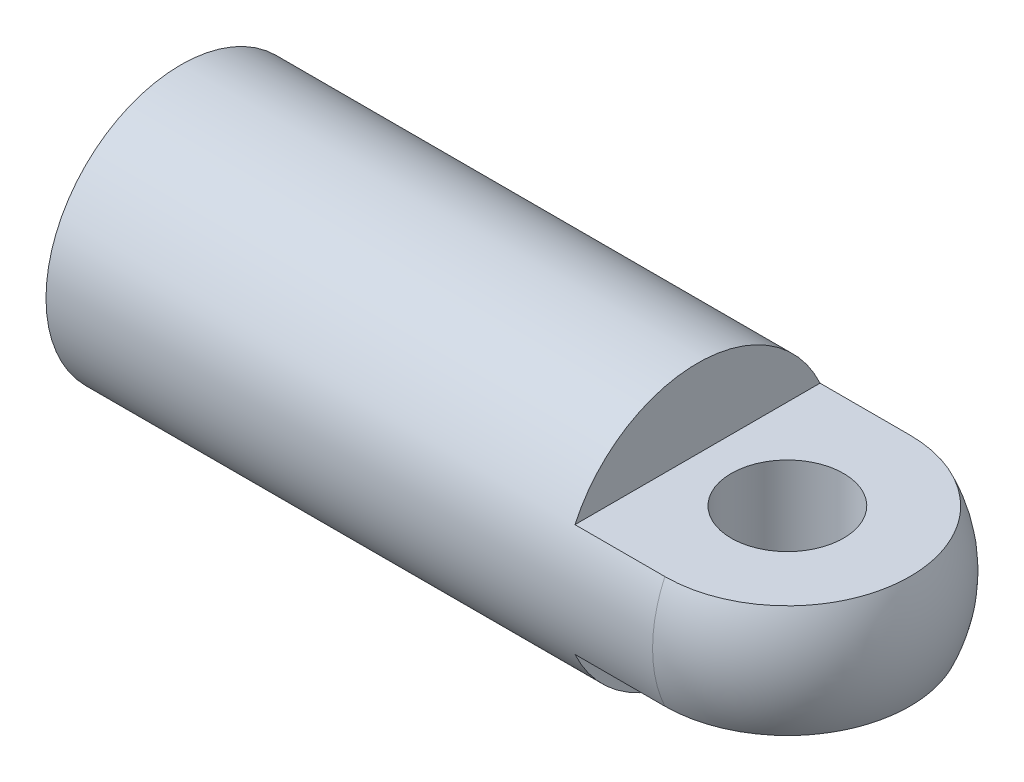
ISO-10303-21;
HEADER;
FILE_DESCRIPTION(('STEP AP214'),'2;1');
FILE_NAME('part.step','',(''),(''),'','','');
FILE_SCHEMA(('AUTOMOTIVE_DESIGN { 1 0 10303 214 1 1 1 1 }'));
ENDSEC;
DATA;
#1=APPLICATION_CONTEXT('core data for automotive mechanical design processes');
#2=APPLICATION_PROTOCOL_DEFINITION('international standard','automotive_design',2000,#1);
#3=PRODUCT_CONTEXT('',#1,'mechanical');
#4=PRODUCT('Part','Part','',(#3));
#5=PRODUCT_RELATED_PRODUCT_CATEGORY('part','',(#4));
#6=PRODUCT_DEFINITION_FORMATION('','',#4);
#7=PRODUCT_DEFINITION_CONTEXT('part definition',#1,'design');
#8=PRODUCT_DEFINITION('design','',#6,#7);
#9=PRODUCT_DEFINITION_SHAPE('','',#8);
#10=(LENGTH_UNIT() NAMED_UNIT(*) SI_UNIT(.MILLI.,.METRE.));
#11=(NAMED_UNIT(*) PLANE_ANGLE_UNIT() SI_UNIT($,.RADIAN.));
#12=(NAMED_UNIT(*) SI_UNIT($,.STERADIAN.) SOLID_ANGLE_UNIT());
#13=UNCERTAINTY_MEASURE_WITH_UNIT(LENGTH_MEASURE(1.E-05),#10,'distance_accuracy_value','');
#14=(GEOMETRIC_REPRESENTATION_CONTEXT(3) GLOBAL_UNCERTAINTY_ASSIGNED_CONTEXT((#13)) GLOBAL_UNIT_ASSIGNED_CONTEXT((#10,
#11,#12)) REPRESENTATION_CONTEXT('',''));
#15=CARTESIAN_POINT('',(0.,0.,0.));
#16=DIRECTION('',(0.,0.,1.));
#17=DIRECTION('',(1.,0.,0.));
#18=AXIS2_PLACEMENT_3D('',#15,#16,#17);
#19=CARTESIAN_POINT('',(-212.857142857143,0.,-80.));
#20=DIRECTION('',(-1.,0.,0.));
#21=DIRECTION('',(0.,0.,1.));
#22=AXIS2_PLACEMENT_3D('',#19,#20,#21);
#23=PLANE('',#22);
#24=CARTESIAN_POINT('',(-212.857142857143,0.,0.));
#25=DIRECTION('',(-1.,0.,0.));
#26=DIRECTION('',(0.,0.,1.));
#27=AXIS2_PLACEMENT_3D('',#24,#25,#26);
#28=CIRCLE('',#27,100.);
#29=CARTESIAN_POINT('',(-212.857142857143,0.,100.));
#30=VERTEX_POINT('',#29);
#31=EDGE_CURVE('E111',#30,#30,#28,.T.);
#32=ORIENTED_EDGE('',*,*,#31,.F.);
#33=EDGE_LOOP('',(#32));
#34=FACE_BOUND('',#33,.T.);
#35=CARTESIAN_POINT('',(-212.857142857143,0.,0.));
#36=DIRECTION('',(-1.,0.,0.));
#37=DIRECTION('',(0.,0.,1.));
#38=AXIS2_PLACEMENT_3D('',#35,#36,#37);
#39=CIRCLE('',#38,80.);
#40=CARTESIAN_POINT('',(-212.857142857143,0.,80.));
#41=VERTEX_POINT('',#40);
#42=EDGE_CURVE('E125',#41,#41,#39,.T.);
#43=ORIENTED_EDGE('',*,*,#42,.T.);
#44=EDGE_LOOP('',(#43));
#45=FACE_BOUND('',#44,.T.);
#46=ADVANCED_FACE('F45',(#34,#45),#23,.F.);
#47=CARTESIAN_POINT('',(-156.292678097973,0.,0.));
#48=DIRECTION('',(-1.,0.,0.));
#49=DIRECTION('',(0.,0.,1.));
#50=AXIS2_PLACEMENT_3D('',#47,#48,#49);
#51=CYLINDRICAL_SURFACE('',#50,80.);
#52=ORIENTED_EDGE('',*,*,#42,.F.);
#53=EDGE_LOOP('',(#52));
#54=FACE_BOUND('',#53,.T.);
#55=CARTESIAN_POINT('',(-232.857142857143,0.,0.));
#56=DIRECTION('',(-1.,0.,0.));
#57=DIRECTION('',(0.,0.,1.));
#58=AXIS2_PLACEMENT_3D('',#55,#56,#57);
#59=CIRCLE('',#58,80.);
#60=CARTESIAN_POINT('',(-232.857142857143,0.,80.));
#61=VERTEX_POINT('',#60);
#62=EDGE_CURVE('E122',#61,#61,#59,.T.);
#63=ORIENTED_EDGE('',*,*,#62,.T.);
#64=EDGE_LOOP('',(#63));
#65=FACE_BOUND('',#64,.T.);
#66=ADVANCED_FACE('F155',(#54,#65),#51,.F.);
#67=CARTESIAN_POINT('',(-232.857142857143,0.,-80.));
#68=DIRECTION('',(1.,0.,0.));
#69=DIRECTION('',(0.,0.,-1.));
#70=AXIS2_PLACEMENT_3D('',#67,#68,#69);
#71=PLANE('',#70);
#72=ORIENTED_EDGE('',*,*,#62,.F.);
#73=EDGE_LOOP('',(#72));
#74=FACE_BOUND('',#73,.T.);
#75=CARTESIAN_POINT('',(-232.857142857143,0.,0.));
#76=DIRECTION('',(-1.,0.,0.));
#77=DIRECTION('',(0.,0.,1.));
#78=AXIS2_PLACEMENT_3D('',#75,#76,#77);
#79=CIRCLE('',#78,120.);
#80=CARTESIAN_POINT('',(-232.857142857143,0.,120.));
#81=VERTEX_POINT('',#80);
#82=EDGE_CURVE('E119',#81,#81,#79,.T.);
#83=ORIENTED_EDGE('',*,*,#82,.T.);
#84=EDGE_LOOP('',(#83));
#85=FACE_BOUND('',#84,.T.);
#86=ADVANCED_FACE('F160',(#74,#85),#71,.F.);
#87=CARTESIAN_POINT('',(-156.292678097973,0.,0.));
#88=DIRECTION('',(-1.,0.,0.));
#89=DIRECTION('',(0.,0.,1.));
#90=AXIS2_PLACEMENT_3D('',#87,#88,#89);
#91=CYLINDRICAL_SURFACE('',#90,120.);
#92=ORIENTED_EDGE('',*,*,#82,.F.);
#93=EDGE_LOOP('',(#92));
#94=FACE_BOUND('',#93,.T.);
#95=CARTESIAN_POINT('',(307.142857142857,0.,0.));
#96=DIRECTION('',(-1.,0.,0.));
#97=DIRECTION('',(0.,0.,1.));
#98=AXIS2_PLACEMENT_3D('',#95,#96,#97);
#99=CIRCLE('',#98,120.);
#100=CARTESIAN_POINT('',(307.142857142857,-50.,109.087121146357));
#101=VERTEX_POINT('',#100);
#102=CARTESIAN_POINT('',(307.142857142857,50.,109.087121146357));
#103=VERTEX_POINT('',#102);
#104=EDGE_CURVE('E117',#101,#103,#99,.T.);
#105=ORIENTED_EDGE('',*,*,#104,.T.);
#106=DIRECTION('',(-1.,0.,0.));
#107=VECTOR('',#106,1.);
#108=CARTESIAN_POINT('',(-156.292678097973,49.9999999999999,109.087121146357));
#109=LINE('',#108,#107);
#110=CARTESIAN_POINT('',(227.142857142857,50.,109.087121146357));
#111=VERTEX_POINT('',#110);
#112=EDGE_CURVE('E68',#103,#111,#109,.T.);
#113=ORIENTED_EDGE('',*,*,#112,.T.);
#114=CARTESIAN_POINT('',(227.142857142857,0.,0.));
#115=DIRECTION('',(-1.,0.,0.));
#116=DIRECTION('',(0.,0.,1.));
#117=AXIS2_PLACEMENT_3D('',#114,#115,#116);
#118=CIRCLE('',#117,120.);
#119=CARTESIAN_POINT('',(227.142857142857,50.,-109.087121146357));
#120=VERTEX_POINT('',#119);
#121=EDGE_CURVE('E13',#111,#120,#118,.T.);
#122=ORIENTED_EDGE('',*,*,#121,.T.);
#123=DIRECTION('',(-1.,0.,0.));
#124=VECTOR('',#123,1.);
#125=CARTESIAN_POINT('',(-156.292678097973,49.9999999999999,-109.087121146357));
#126=LINE('',#125,#124);
#127=CARTESIAN_POINT('',(307.142857142857,50.,-109.087121146357));
#128=VERTEX_POINT('',#127);
#129=EDGE_CURVE('E105',#120,#128,#126,.F.);
#130=ORIENTED_EDGE('',*,*,#129,.T.);
#131=CARTESIAN_POINT('',(307.142857142857,-50.,-109.087121146357));
#132=VERTEX_POINT('',#131);
#133=EDGE_CURVE('E104',#128,#132,#99,.T.);
#134=ORIENTED_EDGE('',*,*,#133,.T.);
#135=DIRECTION('',(-1.,0.,0.));
#136=VECTOR('',#135,1.);
#137=CARTESIAN_POINT('',(-156.292678097973,-50.,-109.087121146357));
#138=LINE('',#137,#136);
#139=CARTESIAN_POINT('',(227.142857142857,-50.,-109.087121146357));
#140=VERTEX_POINT('',#139);
#141=EDGE_CURVE('E60',#132,#140,#138,.T.);
#142=ORIENTED_EDGE('',*,*,#141,.T.);
#143=CARTESIAN_POINT('',(227.142857142857,0.,0.));
#144=DIRECTION('',(-1.,0.,0.));
#145=DIRECTION('',(0.,0.,1.));
#146=AXIS2_PLACEMENT_3D('',#143,#144,#145);
#147=CIRCLE('',#146,120.);
#148=CARTESIAN_POINT('',(227.142857142857,-50.,109.087121146357));
#149=VERTEX_POINT('',#148);
#150=EDGE_CURVE('E53',#140,#149,#147,.T.);
#151=ORIENTED_EDGE('',*,*,#150,.T.);
#152=DIRECTION('',(-1.,0.,0.));
#153=VECTOR('',#152,1.);
#154=CARTESIAN_POINT('',(-156.292678097973,-50.,109.087121146357));
#155=LINE('',#154,#153);
#156=EDGE_CURVE('E95',#149,#101,#155,.F.);
#157=ORIENTED_EDGE('',*,*,#156,.T.);
#158=EDGE_LOOP('',(#105,#113,#122,#130,#134,#142,#151,#157));
#159=FACE_BOUND('',#158,.T.);
#160=ADVANCED_FACE('F101',(#94,#159),#91,.T.);
#161=CARTESIAN_POINT('',(307.142857142857,0.,0.));
#162=DIRECTION('',(-1.,0.,0.));
#163=DIRECTION('',(0.,0.,-1.));
#164=AXIS2_PLACEMENT_3D('',#161,#162,#163);
#165=SPHERICAL_SURFACE('',#164,120.);
#166=ORIENTED_EDGE('',*,*,#133,.F.);
#167=CARTESIAN_POINT('',(307.142857142857,50.,0.));
#168=DIRECTION('',(0.,-1.,0.));
#169=DIRECTION('',(1.,0.,0.));
#170=AXIS2_PLACEMENT_3D('',#167,#168,#169);
#171=CIRCLE('',#170,109.087121146357);
#172=EDGE_CURVE('E92',#128,#103,#171,.T.);
#173=ORIENTED_EDGE('',*,*,#172,.T.);
#174=ORIENTED_EDGE('',*,*,#104,.F.);
#175=CARTESIAN_POINT('',(307.142857142857,-50.,0.));
#176=DIRECTION('',(0.,1.,0.));
#177=DIRECTION('',(-1.,0.,0.));
#178=AXIS2_PLACEMENT_3D('',#175,#176,#177);
#179=CIRCLE('',#178,109.087121146357);
#180=EDGE_CURVE('E128',#101,#132,#179,.T.);
#181=ORIENTED_EDGE('',*,*,#180,.T.);
#182=EDGE_LOOP('',(#166,#173,#174,#181));
#183=FACE_BOUND('',#182,.T.);
#184=ADVANCED_FACE('F132',(#183),#165,.T.);
#185=CARTESIAN_POINT('',(187.142857142857,0.,-100.));
#186=DIRECTION('',(1.,0.,0.));
#187=DIRECTION('',(0.,0.,-1.));
#188=AXIS2_PLACEMENT_3D('',#185,#186,#187);
#189=PLANE('',#188);
#190=CARTESIAN_POINT('',(187.142857142857,0.,0.));
#191=DIRECTION('',(-1.,0.,0.));
#192=DIRECTION('',(0.,0.,1.));
#193=AXIS2_PLACEMENT_3D('',#190,#191,#192);
#194=CIRCLE('',#193,100.);
#195=CARTESIAN_POINT('',(187.142857142857,0.,100.));
#196=VERTEX_POINT('',#195);
#197=EDGE_CURVE('E114',#196,#196,#194,.T.);
#198=ORIENTED_EDGE('',*,*,#197,.T.);
#199=EDGE_LOOP('',(#198));
#200=FACE_BOUND('',#199,.T.);
#201=ADVANCED_FACE('F178',(#200),#189,.F.);
#202=CARTESIAN_POINT('',(-156.292678097973,0.,0.));
#203=DIRECTION('',(-1.,0.,0.));
#204=DIRECTION('',(0.,0.,1.));
#205=AXIS2_PLACEMENT_3D('',#202,#203,#204);
#206=CYLINDRICAL_SURFACE('',#205,100.);
#207=ORIENTED_EDGE('',*,*,#197,.F.);
#208=EDGE_LOOP('',(#207));
#209=FACE_BOUND('',#208,.T.);
#210=ORIENTED_EDGE('',*,*,#31,.T.);
#211=EDGE_LOOP('',(#210));
#212=FACE_BOUND('',#211,.T.);
#213=ADVANCED_FACE('F183',(#209,#212),#206,.F.);
#214=CARTESIAN_POINT('',(525.404105683454,-50.,-120.));
#215=DIRECTION('',(0.,1.,0.));
#216=DIRECTION('',(-1.,0.,0.));
#217=AXIS2_PLACEMENT_3D('',#214,#215,#216);
#218=PLANE('',#217);
#219=CARTESIAN_POINT('',(307.142857142857,-50.,0.));
#220=DIRECTION('',(0.,1.,0.));
#221=DIRECTION('',(-1.,0.,0.));
#222=AXIS2_PLACEMENT_3D('',#219,#220,#221);
#223=CIRCLE('',#222,50.0000000000001);
#224=CARTESIAN_POINT('',(257.142857142857,-50.,0.));
#225=VERTEX_POINT('',#224);
#226=EDGE_CURVE('E97',#225,#225,#223,.T.);
#227=ORIENTED_EDGE('',*,*,#226,.T.);
#228=EDGE_LOOP('',(#227));
#229=FACE_BOUND('',#228,.T.);
#230=ORIENTED_EDGE('',*,*,#180,.F.);
#231=ORIENTED_EDGE('',*,*,#156,.F.);
#232=DIRECTION('',(0.,0.,1.));
#233=VECTOR('',#232,1.);
#234=CARTESIAN_POINT('',(227.142857142857,-50.,-120.));
#235=LINE('',#234,#233);
#236=EDGE_CURVE('E89',#140,#149,#235,.T.);
#237=ORIENTED_EDGE('',*,*,#236,.F.);
#238=ORIENTED_EDGE('',*,*,#141,.F.);
#239=EDGE_LOOP('',(#230,#231,#237,#238));
#240=FACE_BOUND('',#239,.T.);
#241=ADVANCED_FACE('F94',(#229,#240),#218,.F.);
#242=CARTESIAN_POINT('',(227.142857142857,-120.,-120.));
#243=DIRECTION('',(-1.,0.,0.));
#244=DIRECTION('',(0.,0.,1.));
#245=AXIS2_PLACEMENT_3D('',#242,#243,#244);
#246=PLANE('',#245);
#247=ORIENTED_EDGE('',*,*,#236,.T.);
#248=ORIENTED_EDGE('',*,*,#150,.F.);
#249=EDGE_LOOP('',(#247,#248));
#250=FACE_BOUND('',#249,.T.);
#251=ADVANCED_FACE('F88',(#250),#246,.F.);
#252=CARTESIAN_POINT('',(227.142857142857,50.,-120.));
#253=DIRECTION('',(-1.,0.,0.));
#254=DIRECTION('',(0.,0.,1.));
#255=AXIS2_PLACEMENT_3D('',#252,#253,#254);
#256=PLANE('',#255);
#257=DIRECTION('',(0.,0.,1.));
#258=VECTOR('',#257,1.);
#259=CARTESIAN_POINT('',(227.142857142857,50.,-120.));
#260=LINE('',#259,#258);
#261=EDGE_CURVE('E96',#120,#111,#260,.T.);
#262=ORIENTED_EDGE('',*,*,#261,.F.);
#263=ORIENTED_EDGE('',*,*,#121,.F.);
#264=EDGE_LOOP('',(#262,#263));
#265=FACE_BOUND('',#264,.T.);
#266=ADVANCED_FACE('F135',(#265),#256,.F.);
#267=CARTESIAN_POINT('',(525.404105683454,50.,-120.));
#268=DIRECTION('',(0.,-1.,0.));
#269=DIRECTION('',(1.,0.,0.));
#270=AXIS2_PLACEMENT_3D('',#267,#268,#269);
#271=PLANE('',#270);
#272=CARTESIAN_POINT('',(307.142857142857,50.,0.));
#273=DIRECTION('',(0.,-1.,0.));
#274=DIRECTION('',(1.,0.,0.));
#275=AXIS2_PLACEMENT_3D('',#272,#273,#274);
#276=CIRCLE('',#275,50.0000000000001);
#277=CARTESIAN_POINT('',(257.142857142857,50.,0.));
#278=VERTEX_POINT('',#277);
#279=EDGE_CURVE('E48',#278,#278,#276,.T.);
#280=ORIENTED_EDGE('',*,*,#279,.T.);
#281=EDGE_LOOP('',(#280));
#282=FACE_BOUND('',#281,.T.);
#283=ORIENTED_EDGE('',*,*,#172,.F.);
#284=ORIENTED_EDGE('',*,*,#129,.F.);
#285=ORIENTED_EDGE('',*,*,#261,.T.);
#286=ORIENTED_EDGE('',*,*,#112,.F.);
#287=EDGE_LOOP('',(#283,#284,#285,#286));
#288=FACE_BOUND('',#287,.T.);
#289=ADVANCED_FACE('F136',(#282,#288),#271,.F.);
#290=CARTESIAN_POINT('',(307.142857142857,-120.,0.));
#291=DIRECTION('',(0.,1.,0.));
#292=DIRECTION('',(-1.,0.,0.));
#293=AXIS2_PLACEMENT_3D('',#290,#291,#292);
#294=CYLINDRICAL_SURFACE('',#293,50.0000000000001);
#295=CARTESIAN_POINT('',(257.142857142857,50.,0.));
#296=CARTESIAN_POINT('',(257.142857142857,48.9583333333333,0.));
#297=CARTESIAN_POINT('',(257.142857142857,47.9166666666666,0.));
#298=CARTESIAN_POINT('',(257.142857142857,45.8333333333333,0.));
#299=CARTESIAN_POINT('',(257.142857142857,44.7916666666666,0.));
#300=CARTESIAN_POINT('',(257.142857142857,42.7083333333333,0.));
#301=CARTESIAN_POINT('',(257.142857142857,41.6666666666666,0.));
#302=CARTESIAN_POINT('',(257.142857142857,39.5833333333333,0.));
#303=CARTESIAN_POINT('',(257.142857142857,38.5416666666666,0.));
#304=CARTESIAN_POINT('',(257.142857142857,36.4583333333333,0.));
#305=CARTESIAN_POINT('',(257.142857142857,35.4166666666666,0.));
#306=CARTESIAN_POINT('',(257.142857142857,33.3333333333333,0.));
#307=CARTESIAN_POINT('',(257.142857142857,32.2916666666666,0.));
#308=CARTESIAN_POINT('',(257.142857142857,30.2083333333333,0.));
#309=CARTESIAN_POINT('',(257.142857142857,29.1666666666666,0.));
#310=CARTESIAN_POINT('',(257.142857142857,27.0833333333333,0.));
#311=CARTESIAN_POINT('',(257.142857142857,26.0416666666666,0.));
#312=CARTESIAN_POINT('',(257.142857142857,23.9583333333333,0.));
#313=CARTESIAN_POINT('',(257.142857142857,22.9166666666666,0.));
#314=CARTESIAN_POINT('',(257.142857142857,20.8333333333333,0.));
#315=CARTESIAN_POINT('',(257.142857142857,19.7916666666666,0.));
#316=CARTESIAN_POINT('',(257.142857142857,17.7083333333333,0.));
#317=CARTESIAN_POINT('',(257.142857142857,16.6666666666666,0.));
#318=CARTESIAN_POINT('',(257.142857142857,14.5833333333333,0.));
#319=CARTESIAN_POINT('',(257.142857142857,13.5416666666666,0.));
#320=CARTESIAN_POINT('',(257.142857142857,11.4583333333333,0.));
#321=CARTESIAN_POINT('',(257.142857142857,10.4166666666666,0.));
#322=CARTESIAN_POINT('',(257.142857142857,8.3333333333333,0.));
#323=CARTESIAN_POINT('',(257.142857142857,7.29166666666664,0.));
#324=CARTESIAN_POINT('',(257.142857142857,5.20833333333331,0.));
#325=CARTESIAN_POINT('',(257.142857142857,4.16666666666664,0.));
#326=CARTESIAN_POINT('',(257.142857142857,2.08333333333331,0.));
#327=CARTESIAN_POINT('',(257.142857142857,1.04166666666664,0.));
#328=CARTESIAN_POINT('',(257.142857142857,-1.0416666666667,0.));
#329=CARTESIAN_POINT('',(257.142857142857,-2.08333333333336,0.));
#330=CARTESIAN_POINT('',(257.142857142857,-4.1666666666667,0.));
#331=CARTESIAN_POINT('',(257.142857142857,-5.20833333333337,0.));
#332=CARTESIAN_POINT('',(257.142857142857,-7.2916666666667,0.));
#333=CARTESIAN_POINT('',(257.142857142857,-8.33333333333336,0.));
#334=CARTESIAN_POINT('',(257.142857142857,-10.4166666666667,0.));
#335=CARTESIAN_POINT('',(257.142857142857,-11.4583333333334,0.));
#336=CARTESIAN_POINT('',(257.142857142857,-13.5416666666667,0.));
#337=CARTESIAN_POINT('',(257.142857142857,-14.5833333333334,0.));
#338=CARTESIAN_POINT('',(257.142857142857,-16.6666666666667,0.));
#339=CARTESIAN_POINT('',(257.142857142857,-17.7083333333334,0.));
#340=CARTESIAN_POINT('',(257.142857142857,-19.7916666666667,0.));
#341=CARTESIAN_POINT('',(257.142857142857,-20.8333333333334,0.));
#342=CARTESIAN_POINT('',(257.142857142857,-22.9166666666667,0.));
#343=CARTESIAN_POINT('',(257.142857142857,-23.9583333333334,0.));
#344=CARTESIAN_POINT('',(257.142857142857,-26.0416666666667,0.));
#345=CARTESIAN_POINT('',(257.142857142857,-27.0833333333334,0.));
#346=CARTESIAN_POINT('',(257.142857142857,-29.1666666666667,0.));
#347=CARTESIAN_POINT('',(257.142857142857,-30.2083333333334,0.));
#348=CARTESIAN_POINT('',(257.142857142857,-32.2916666666667,0.));
#349=CARTESIAN_POINT('',(257.142857142857,-33.3333333333334,0.));
#350=CARTESIAN_POINT('',(257.142857142857,-35.4166666666667,0.));
#351=CARTESIAN_POINT('',(257.142857142857,-36.4583333333333,0.));
#352=CARTESIAN_POINT('',(257.142857142857,-38.5416666666667,0.));
#353=CARTESIAN_POINT('',(257.142857142857,-39.5833333333333,0.));
#354=CARTESIAN_POINT('',(257.142857142857,-41.6666666666667,0.));
#355=CARTESIAN_POINT('',(257.142857142857,-42.7083333333333,0.));
#356=CARTESIAN_POINT('',(257.142857142857,-44.7916666666667,0.));
#357=CARTESIAN_POINT('',(257.142857142857,-45.8333333333333,0.));
#358=CARTESIAN_POINT('',(257.142857142857,-47.9166666666667,0.));
#359=CARTESIAN_POINT('',(257.142857142857,-48.9583333333333,0.));
#360=CARTESIAN_POINT('',(257.142857142857,-50.,0.));
#361=B_SPLINE_CURVE_WITH_KNOTS('',3,(#295,#296,#297,#298,#299,#300,#301,#302,#303,#304,#305,
#306,#307,#308,#309,#310,#311,#312,#313,#314,#315,#316,#317,#318,#319,#320,#321,#322,#323,#324,
#325,#326,#327,#328,#329,#330,#331,#332,#333,#334,#335,#336,#337,#338,#339,#340,#341,#342,#343,
#344,#345,#346,#347,#348,#349,#350,#351,#352,#353,#354,#355,#356,#357,#358,#359,#360),
.UNSPECIFIED.,.F.,.F.,(4,2,2,2,2,2,2,2,2,2,2,2,2,2,2,2,2,2,2,2,2,2,2,2,2,2,2,2,2,2,2,2,4),(0.,
3.12499999999999,6.25000000000001,9.37499999999999,12.5,15.625,18.75,21.875,25.,28.125,31.25,
34.375,37.5,40.625,43.75,46.875,50.,53.125,56.25,59.375,62.5,65.625,68.75,71.875,75.,78.125,
81.25,84.375,87.5,90.625,93.75,96.875,100.),.UNSPECIFIED.);
#362=EDGE_CURVE('BSEAM146',#278,#225,#361,.T.);
#363=ORIENTED_EDGE('',*,*,#279,.F.);
#364=ORIENTED_EDGE('',*,*,#226,.F.);
#365=ORIENTED_EDGE('',*,*,#362,.T.);
#366=ORIENTED_EDGE('',*,*,#362,.F.);
#367=EDGE_LOOP('',(#363,#365,#364,#366));
#368=FACE_BOUND('',#367,.T.);
#369=ADVANCED_FACE('F146',(#368),#294,.F.);
#370=CLOSED_SHELL('',(#46,#66,#86,#160,#184,#201,#213,#241,#251,#266,#289,#369));
#371=MANIFOLD_SOLID_BREP('B2',#370);
#372=ADVANCED_BREP_SHAPE_REPRESENTATION('',(#18,#371),#14);
#373=SHAPE_DEFINITION_REPRESENTATION(#9,#372);
ENDSEC;
END-ISO-10303-21;
